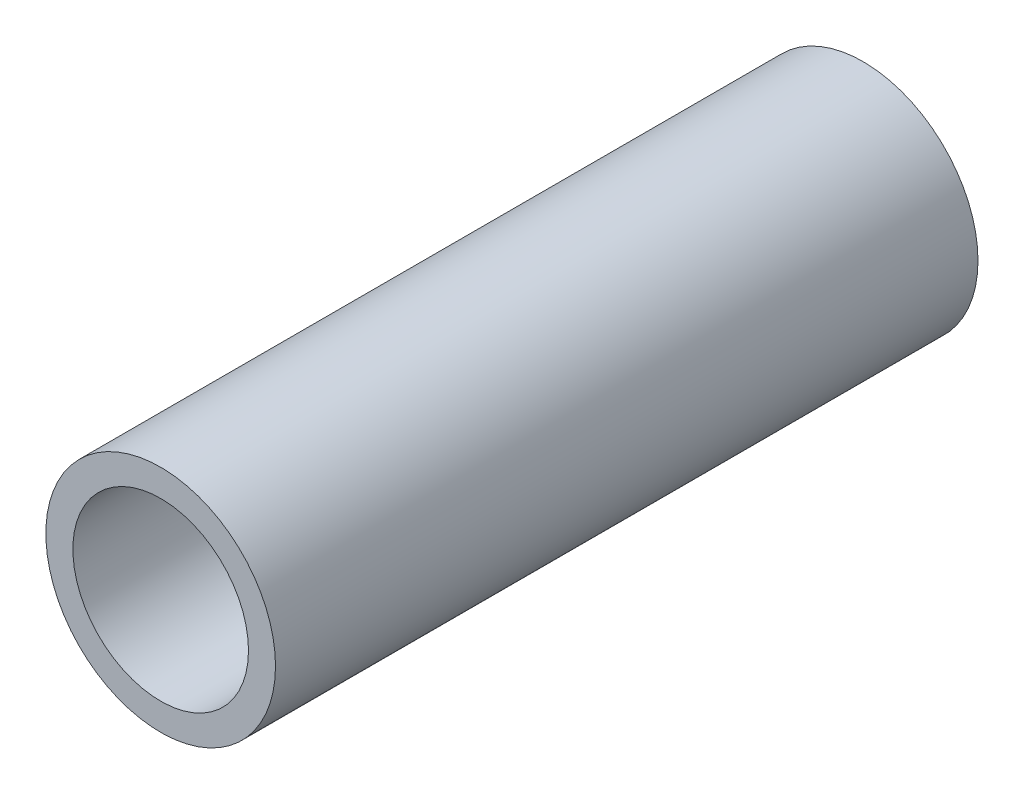
ISO-10303-21;
HEADER;
FILE_DESCRIPTION(('STEP AP214'),'2;1');
FILE_NAME('part.step','',(''),(''),'','','');
FILE_SCHEMA(('AUTOMOTIVE_DESIGN { 1 0 10303 214 1 1 1 1 }'));
ENDSEC;
DATA;
#1=APPLICATION_CONTEXT('core data for automotive mechanical design processes');
#2=APPLICATION_PROTOCOL_DEFINITION('international standard','automotive_design',2000,#1);
#3=PRODUCT_CONTEXT('',#1,'mechanical');
#4=PRODUCT('Part','Part','',(#3));
#5=PRODUCT_RELATED_PRODUCT_CATEGORY('part','',(#4));
#6=PRODUCT_DEFINITION_FORMATION('','',#4);
#7=PRODUCT_DEFINITION_CONTEXT('part definition',#1,'design');
#8=PRODUCT_DEFINITION('design','',#6,#7);
#9=PRODUCT_DEFINITION_SHAPE('','',#8);
#10=(LENGTH_UNIT() NAMED_UNIT(*) SI_UNIT(.MILLI.,.METRE.));
#11=(NAMED_UNIT(*) PLANE_ANGLE_UNIT() SI_UNIT($,.RADIAN.));
#12=(NAMED_UNIT(*) SI_UNIT($,.STERADIAN.) SOLID_ANGLE_UNIT());
#13=UNCERTAINTY_MEASURE_WITH_UNIT(LENGTH_MEASURE(1.E-05),#10,'distance_accuracy_value','');
#14=(GEOMETRIC_REPRESENTATION_CONTEXT(3) GLOBAL_UNCERTAINTY_ASSIGNED_CONTEXT((#13)) GLOBAL_UNIT_ASSIGNED_CONTEXT((#10,
#11,#12)) REPRESENTATION_CONTEXT('',''));
#15=CARTESIAN_POINT('',(0.,0.,0.));
#16=DIRECTION('',(0.,0.,1.));
#17=DIRECTION('',(1.,0.,0.));
#18=AXIS2_PLACEMENT_3D('',#15,#16,#17);
#19=CARTESIAN_POINT('',(0.,0.,52.));
#20=DIRECTION('',(0.,0.,1.));
#21=DIRECTION('',(1.,0.,0.));
#22=AXIS2_PLACEMENT_3D('',#19,#20,#21);
#23=PLANE('',#22);
#24=CARTESIAN_POINT('',(0.,0.,52.));
#25=DIRECTION('',(0.,0.,1.));
#26=DIRECTION('',(1.,0.,0.));
#27=AXIS2_PLACEMENT_3D('',#24,#25,#26);
#28=CIRCLE('',#27,8.5);
#29=CARTESIAN_POINT('',(8.50000000000001,0.,52.));
#30=VERTEX_POINT('',#29);
#31=EDGE_CURVE('E10',#30,#30,#28,.T.);
#32=ORIENTED_EDGE('',*,*,#31,.T.);
#33=EDGE_LOOP('',(#32));
#34=FACE_BOUND('',#33,.T.);
#35=CARTESIAN_POINT('',(0.,0.,52.));
#36=DIRECTION('',(0.,0.,1.));
#37=DIRECTION('',(1.,0.,0.));
#38=AXIS2_PLACEMENT_3D('',#35,#36,#37);
#39=CIRCLE('',#38,6.5);
#40=CARTESIAN_POINT('',(6.50000000000001,0.,52.));
#41=VERTEX_POINT('',#40);
#42=EDGE_CURVE('E40',#41,#41,#39,.T.);
#43=ORIENTED_EDGE('',*,*,#42,.F.);
#44=EDGE_LOOP('',(#43));
#45=FACE_BOUND('',#44,.T.);
#46=ADVANCED_FACE('F29',(#34,#45),#23,.T.);
#47=CARTESIAN_POINT('',(0.,0.,0.));
#48=DIRECTION('',(0.,0.,1.));
#49=DIRECTION('',(1.,0.,0.));
#50=AXIS2_PLACEMENT_3D('',#47,#48,#49);
#51=PLANE('',#50);
#52=CARTESIAN_POINT('',(0.,0.,0.));
#53=DIRECTION('',(0.,0.,1.));
#54=DIRECTION('',(1.,0.,0.));
#55=AXIS2_PLACEMENT_3D('',#52,#53,#54);
#56=CIRCLE('',#55,8.5);
#57=CARTESIAN_POINT('',(8.50000000000001,0.,0.));
#58=VERTEX_POINT('',#57);
#59=EDGE_CURVE('E36',#58,#58,#56,.T.);
#60=ORIENTED_EDGE('',*,*,#59,.F.);
#61=EDGE_LOOP('',(#60));
#62=FACE_BOUND('',#61,.T.);
#63=CARTESIAN_POINT('',(0.,0.,0.));
#64=DIRECTION('',(0.,0.,1.));
#65=DIRECTION('',(1.,0.,0.));
#66=AXIS2_PLACEMENT_3D('',#63,#64,#65);
#67=CIRCLE('',#66,6.5);
#68=CARTESIAN_POINT('',(6.50000000000001,0.,0.));
#69=VERTEX_POINT('',#68);
#70=EDGE_CURVE('E44',#69,#69,#67,.T.);
#71=ORIENTED_EDGE('',*,*,#70,.T.);
#72=EDGE_LOOP('',(#71));
#73=FACE_BOUND('',#72,.T.);
#74=ADVANCED_FACE('F50',(#62,#73),#51,.F.);
#75=CARTESIAN_POINT('',(0.,0.,52.));
#76=DIRECTION('',(0.,0.,-1.));
#77=DIRECTION('',(-1.,0.,0.));
#78=AXIS2_PLACEMENT_3D('',#75,#76,#77);
#79=CYLINDRICAL_SURFACE('',#78,8.5);
#80=ORIENTED_EDGE('',*,*,#31,.F.);
#81=EDGE_LOOP('',(#80));
#82=FACE_BOUND('',#81,.T.);
#83=ORIENTED_EDGE('',*,*,#59,.T.);
#84=EDGE_LOOP('',(#83));
#85=FACE_BOUND('',#84,.T.);
#86=ADVANCED_FACE('F31',(#82,#85),#79,.T.);
#87=CARTESIAN_POINT('',(0.,0.,52.));
#88=DIRECTION('',(0.,0.,-1.));
#89=DIRECTION('',(-1.,0.,0.));
#90=AXIS2_PLACEMENT_3D('',#87,#88,#89);
#91=CYLINDRICAL_SURFACE('',#90,6.5);
#92=ORIENTED_EDGE('',*,*,#42,.T.);
#93=EDGE_LOOP('',(#92));
#94=FACE_BOUND('',#93,.T.);
#95=ORIENTED_EDGE('',*,*,#70,.F.);
#96=EDGE_LOOP('',(#95));
#97=FACE_BOUND('',#96,.T.);
#98=ADVANCED_FACE('F52',(#94,#97),#91,.F.);
#99=CLOSED_SHELL('',(#46,#74,#86,#98));
#100=MANIFOLD_SOLID_BREP('B2',#99);
#101=ADVANCED_BREP_SHAPE_REPRESENTATION('',(#18,#100),#14);
#102=SHAPE_DEFINITION_REPRESENTATION(#9,#101);
ENDSEC;
END-ISO-10303-21;
